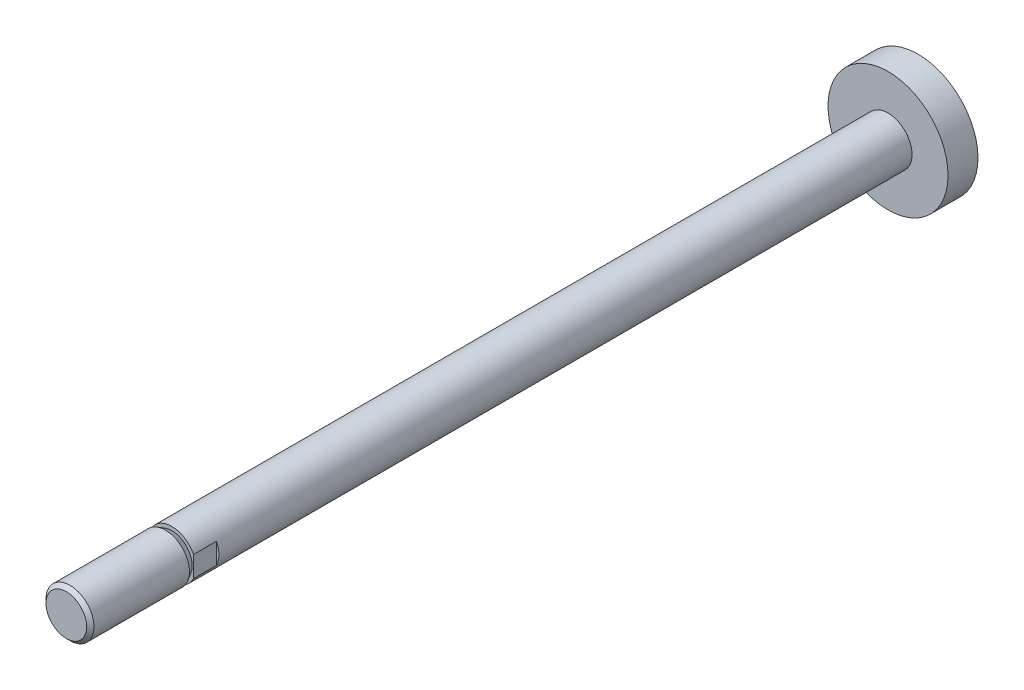
ISO-10303-21;
HEADER;
FILE_DESCRIPTION(('STEP AP214'),'2;1');
FILE_NAME('part.step','',(''),(''),'','','');
FILE_SCHEMA(('AUTOMOTIVE_DESIGN { 1 0 10303 214 1 1 1 1 }'));
ENDSEC;
DATA;
#1=APPLICATION_CONTEXT('core data for automotive mechanical design processes');
#2=APPLICATION_PROTOCOL_DEFINITION('international standard','automotive_design',2000,#1);
#3=PRODUCT_CONTEXT('',#1,'mechanical');
#4=PRODUCT('Part','Part','',(#3));
#5=PRODUCT_RELATED_PRODUCT_CATEGORY('part','',(#4));
#6=PRODUCT_DEFINITION_FORMATION('','',#4);
#7=PRODUCT_DEFINITION_CONTEXT('part definition',#1,'design');
#8=PRODUCT_DEFINITION('design','',#6,#7);
#9=PRODUCT_DEFINITION_SHAPE('','',#8);
#10=(LENGTH_UNIT() NAMED_UNIT(*) SI_UNIT(.MILLI.,.METRE.));
#11=(NAMED_UNIT(*) PLANE_ANGLE_UNIT() SI_UNIT($,.RADIAN.));
#12=(NAMED_UNIT(*) SI_UNIT($,.STERADIAN.) SOLID_ANGLE_UNIT());
#13=UNCERTAINTY_MEASURE_WITH_UNIT(LENGTH_MEASURE(1.E-05),#10,'distance_accuracy_value','');
#14=(GEOMETRIC_REPRESENTATION_CONTEXT(3) GLOBAL_UNCERTAINTY_ASSIGNED_CONTEXT((#13)) GLOBAL_UNIT_ASSIGNED_CONTEXT((#10,
#11,#12)) REPRESENTATION_CONTEXT('',''));
#15=CARTESIAN_POINT('',(0.,0.,0.));
#16=DIRECTION('',(0.,0.,1.));
#17=DIRECTION('',(1.,0.,0.));
#18=AXIS2_PLACEMENT_3D('',#15,#16,#17);
#19=CARTESIAN_POINT('',(0.,2.1165,50.));
#20=DIRECTION('',(0.,0.,1.));
#21=DIRECTION('',(1.,0.,0.));
#22=AXIS2_PLACEMENT_3D('',#19,#20,#21);
#23=PLANE('',#22);
#24=CARTESIAN_POINT('',(0.,0.,49.9999999999545));
#25=DIRECTION('',(0.,0.,-1.));
#26=DIRECTION('',(-1.,0.,0.));
#27=AXIS2_PLACEMENT_3D('',#24,#25,#26);
#28=CIRCLE('',#27,4.23300000005611);
#29=CARTESIAN_POINT('',(-4.23300000005611,0.,49.9999999999545));
#30=VERTEX_POINT('',#29);
#31=EDGE_CURVE('E20',#30,#30,#28,.T.);
#32=ORIENTED_EDGE('',*,*,#31,.F.);
#33=EDGE_LOOP('',(#32));
#34=FACE_BOUND('',#33,.T.);
#35=ADVANCED_FACE('F16',(#34),#23,.T.);
#36=CARTESIAN_POINT('',(0.,0.,49.2330000000152));
#37=DIRECTION('',(0.,0.,-1.));
#38=DIRECTION('',(-1.,0.,0.));
#39=AXIS2_PLACEMENT_3D('',#36,#37,#38);
#40=CONICAL_SURFACE('',#39,4.99999999999545,0.785398163397448);
#41=ORIENTED_EDGE('',*,*,#31,.T.);
#42=EDGE_LOOP('',(#41));
#43=FACE_BOUND('',#42,.T.);
#44=CARTESIAN_POINT('',(0.,0.,49.233));
#45=DIRECTION('',(0.,0.,1.));
#46=DIRECTION('',(1.,0.,0.));
#47=AXIS2_PLACEMENT_3D('',#44,#45,#46);
#48=CIRCLE('',#47,5.);
#49=CARTESIAN_POINT('',(5.,0.,49.233));
#50=VERTEX_POINT('',#49);
#51=EDGE_CURVE('E103',#50,#50,#48,.F.);
#52=ORIENTED_EDGE('',*,*,#51,.F.);
#53=EDGE_LOOP('',(#52));
#54=FACE_BOUND('',#53,.T.);
#55=ADVANCED_FACE('F215',(#43,#54),#40,.T.);
#56=CARTESIAN_POINT('',(0.,0.,39.2807414847027));
#57=DIRECTION('',(0.,0.,1.));
#58=DIRECTION('',(1.,0.,0.));
#59=AXIS2_PLACEMENT_3D('',#56,#57,#58);
#60=CYLINDRICAL_SURFACE('',#59,5.);
#61=ORIENTED_EDGE('',*,*,#51,.T.);
#62=EDGE_LOOP('',(#61));
#63=FACE_BOUND('',#62,.T.);
#64=CARTESIAN_POINT('',(0.,0.,29.328482969504));
#65=DIRECTION('',(0.,0.,1.));
#66=DIRECTION('',(0.,1.,0.));
#67=AXIS2_PLACEMENT_3D('',#64,#65,#66);
#68=CIRCLE('',#67,4.99999999999545);
#69=CARTESIAN_POINT('',(0.,4.99999999999545,29.328482969504));
#70=VERTEX_POINT('',#69);
#71=EDGE_CURVE('E63',#70,#70,#68,.F.);
#72=ORIENTED_EDGE('',*,*,#71,.F.);
#73=EDGE_LOOP('',(#72));
#74=FACE_BOUND('',#73,.T.);
#75=ADVANCED_FACE('F206',(#63,#74),#60,.T.);
#76=CARTESIAN_POINT('',(0.,6.25,-127.5));
#77=DIRECTION('',(0.,0.,-1.));
#78=DIRECTION('',(-1.,0.,0.));
#79=AXIS2_PLACEMENT_3D('',#76,#77,#78);
#80=PLANE('',#79);
#81=CARTESIAN_POINT('',(0.,0.,-127.5));
#82=DIRECTION('',(0.,0.,1.));
#83=DIRECTION('',(1.,0.,0.));
#84=AXIS2_PLACEMENT_3D('',#81,#82,#83);
#85=CIRCLE('',#84,12.5);
#86=CARTESIAN_POINT('',(12.5,0.,-127.5));
#87=VERTEX_POINT('',#86);
#88=EDGE_CURVE('E62',#87,#87,#85,.T.);
#89=ORIENTED_EDGE('',*,*,#88,.F.);
#90=EDGE_LOOP('',(#89));
#91=FACE_BOUND('',#90,.T.);
#92=ADVANCED_FACE('F197',(#91),#80,.T.);
#93=CARTESIAN_POINT('',(0.,0.,29.3284829693903));
#94=DIRECTION('',(0.,0.,1.));
#95=DIRECTION('',(1.,0.,0.));
#96=AXIS2_PLACEMENT_3D('',#93,#94,#95);
#97=CONICAL_SURFACE('',#96,4.99999999993861,0.523598775602609);
#98=ORIENTED_EDGE('',*,*,#71,.T.);
#99=EDGE_LOOP('',(#98));
#100=FACE_BOUND('',#99,.T.);
#101=CARTESIAN_POINT('',(0.,0.,27.9999999999632));
#102=DIRECTION('',(0.,0.,1.));
#103=DIRECTION('',(1.,0.,0.));
#104=AXIS2_PLACEMENT_3D('',#101,#102,#103);
#105=CIRCLE('',#104,4.2329999999184);
#106=CARTESIAN_POINT('',(4.2329999999184,0.,27.9999999999632));
#107=VERTEX_POINT('',#106);
#108=EDGE_CURVE('E79',#107,#107,#105,.F.);
#109=ORIENTED_EDGE('',*,*,#108,.F.);
#110=EDGE_LOOP('',(#109));
#111=FACE_BOUND('',#110,.T.);
#112=ADVANCED_FACE('F189',(#100,#111),#97,.T.);
#113=CARTESIAN_POINT('',(-4.5,22.,23.2));
#114=DIRECTION('',(0.,0.,-1.));
#115=DIRECTION('',(-1.,0.,0.));
#116=AXIS2_PLACEMENT_3D('',#113,#114,#115);
#117=PLANE('',#116);
#118=DIRECTION('',(0.,1.,0.));
#119=VECTOR('',#118,1.);
#120=CARTESIAN_POINT('',(-4.5,22.,23.2));
#121=LINE('',#120,#119);
#122=CARTESIAN_POINT('',(-4.5,-2.17944947177034,23.2));
#123=VERTEX_POINT('',#122);
#124=CARTESIAN_POINT('',(-4.5,2.17944947177034,23.2));
#125=VERTEX_POINT('',#124);
#126=EDGE_CURVE('E54',#123,#125,#121,.T.);
#127=ORIENTED_EDGE('',*,*,#126,.T.);
#128=CARTESIAN_POINT('',(0.,0.,23.2));
#129=DIRECTION('',(0.,0.,1.));
#130=DIRECTION('',(1.,0.,0.));
#131=AXIS2_PLACEMENT_3D('',#128,#129,#130);
#132=CIRCLE('',#131,5.);
#133=EDGE_CURVE('E58',#123,#125,#132,.F.);
#134=ORIENTED_EDGE('',*,*,#133,.F.);
#135=EDGE_LOOP('',(#127,#134));
#136=FACE_BOUND('',#135,.T.);
#137=ADVANCED_FACE('F56',(#136),#117,.F.);
#138=CARTESIAN_POINT('',(-4.5,22.,28.));
#139=DIRECTION('',(1.,0.,0.));
#140=DIRECTION('',(0.,0.,-1.));
#141=AXIS2_PLACEMENT_3D('',#138,#139,#140);
#142=PLANE('',#141);
#143=DIRECTION('',(0.,1.,0.));
#144=VECTOR('',#143,1.);
#145=CARTESIAN_POINT('',(-4.5,4.6165,28.));
#146=LINE('',#145,#144);
#147=CARTESIAN_POINT('',(-4.5,2.17944947177034,28.));
#148=VERTEX_POINT('',#147);
#149=CARTESIAN_POINT('',(-4.5,-2.17944947177034,28.));
#150=VERTEX_POINT('',#149);
#151=EDGE_CURVE('E70',#148,#150,#146,.F.);
#152=ORIENTED_EDGE('',*,*,#151,.F.);
#153=DIRECTION('',(0.,0.,1.));
#154=VECTOR('',#153,1.);
#155=CARTESIAN_POINT('',(-4.5,2.17944947177034,-46.625));
#156=LINE('',#155,#154);
#157=EDGE_CURVE('E67',#125,#148,#156,.T.);
#158=ORIENTED_EDGE('',*,*,#157,.F.);
#159=ORIENTED_EDGE('',*,*,#126,.F.);
#160=DIRECTION('',(0.,0.,1.));
#161=VECTOR('',#160,1.);
#162=CARTESIAN_POINT('',(-4.5,-2.17944947177034,-46.625));
#163=LINE('',#162,#161);
#164=EDGE_CURVE('E77',#150,#123,#163,.F.);
#165=ORIENTED_EDGE('',*,*,#164,.F.);
#166=EDGE_LOOP('',(#152,#158,#159,#165));
#167=FACE_BOUND('',#166,.T.);
#168=ADVANCED_FACE('F68',(#167),#142,.F.);
#169=CARTESIAN_POINT('',(0.,0.,-124.375));
#170=DIRECTION('',(0.,0.,1.));
#171=DIRECTION('',(1.,0.,0.));
#172=AXIS2_PLACEMENT_3D('',#169,#170,#171);
#173=CYLINDRICAL_SURFACE('',#172,12.5);
#174=CARTESIAN_POINT('',(0.,0.,-121.25));
#175=DIRECTION('',(0.,0.,1.));
#176=DIRECTION('',(1.,0.,0.));
#177=AXIS2_PLACEMENT_3D('',#174,#175,#176);
#178=CIRCLE('',#177,12.5);
#179=CARTESIAN_POINT('',(12.5,0.,-121.25));
#180=VERTEX_POINT('',#179);
#181=EDGE_CURVE('E73',#180,#180,#178,.T.);
#182=ORIENTED_EDGE('',*,*,#181,.F.);
#183=EDGE_LOOP('',(#182));
#184=FACE_BOUND('',#183,.T.);
#185=ORIENTED_EDGE('',*,*,#88,.T.);
#186=EDGE_LOOP('',(#185));
#187=FACE_BOUND('',#186,.T.);
#188=ADVANCED_FACE('F114',(#184,#187),#173,.T.);
#189=CARTESIAN_POINT('',(15.5,22.,23.2));
#190=DIRECTION('',(0.,0.,-1.));
#191=DIRECTION('',(-1.,0.,0.));
#192=AXIS2_PLACEMENT_3D('',#189,#190,#191);
#193=PLANE('',#192);
#194=DIRECTION('',(0.,1.,0.));
#195=VECTOR('',#194,1.);
#196=CARTESIAN_POINT('',(4.5,22.,23.2));
#197=LINE('',#196,#195);
#198=CARTESIAN_POINT('',(4.5,2.17944947177034,23.2));
#199=VERTEX_POINT('',#198);
#200=CARTESIAN_POINT('',(4.5,-2.17944947177034,23.2));
#201=VERTEX_POINT('',#200);
#202=EDGE_CURVE('E86',#199,#201,#197,.F.);
#203=ORIENTED_EDGE('',*,*,#202,.T.);
#204=CARTESIAN_POINT('',(0.,0.,23.2));
#205=DIRECTION('',(0.,0.,1.));
#206=DIRECTION('',(1.,0.,0.));
#207=AXIS2_PLACEMENT_3D('',#204,#205,#206);
#208=CIRCLE('',#207,5.);
#209=EDGE_CURVE('E98',#199,#201,#208,.F.);
#210=ORIENTED_EDGE('',*,*,#209,.F.);
#211=EDGE_LOOP('',(#203,#210));
#212=FACE_BOUND('',#211,.T.);
#213=ADVANCED_FACE('F116',(#212),#193,.F.);
#214=CARTESIAN_POINT('',(4.5,22.,23.2));
#215=DIRECTION('',(-1.,0.,0.));
#216=DIRECTION('',(0.,0.,1.));
#217=AXIS2_PLACEMENT_3D('',#214,#215,#216);
#218=PLANE('',#217);
#219=ORIENTED_EDGE('',*,*,#202,.F.);
#220=DIRECTION('',(0.,0.,1.));
#221=VECTOR('',#220,1.);
#222=CARTESIAN_POINT('',(4.5,2.17944947177034,-46.625));
#223=LINE('',#222,#221);
#224=CARTESIAN_POINT('',(4.5,2.17944947177034,28.));
#225=VERTEX_POINT('',#224);
#226=EDGE_CURVE('E96',#225,#199,#223,.F.);
#227=ORIENTED_EDGE('',*,*,#226,.F.);
#228=DIRECTION('',(0.,1.,0.));
#229=VECTOR('',#228,1.);
#230=CARTESIAN_POINT('',(4.5,4.6165,28.));
#231=LINE('',#230,#229);
#232=CARTESIAN_POINT('',(4.5,-2.17944947177034,28.));
#233=VERTEX_POINT('',#232);
#234=EDGE_CURVE('E35',#233,#225,#231,.T.);
#235=ORIENTED_EDGE('',*,*,#234,.F.);
#236=DIRECTION('',(0.,0.,1.));
#237=VECTOR('',#236,1.);
#238=CARTESIAN_POINT('',(4.5,-2.17944947177034,-46.625));
#239=LINE('',#238,#237);
#240=EDGE_CURVE('E95',#201,#233,#239,.T.);
#241=ORIENTED_EDGE('',*,*,#240,.F.);
#242=EDGE_LOOP('',(#219,#227,#235,#241));
#243=FACE_BOUND('',#242,.T.);
#244=ADVANCED_FACE('F123',(#243),#218,.F.);
#245=CARTESIAN_POINT('',(0.,4.6165,28.));
#246=DIRECTION('',(0.,0.,1.));
#247=DIRECTION('',(1.,0.,0.));
#248=AXIS2_PLACEMENT_3D('',#245,#246,#247);
#249=PLANE('',#248);
#250=ORIENTED_EDGE('',*,*,#108,.T.);
#251=EDGE_LOOP('',(#250));
#252=FACE_BOUND('',#251,.T.);
#253=CARTESIAN_POINT('',(0.,0.,28.));
#254=DIRECTION('',(0.,0.,1.));
#255=DIRECTION('',(1.,0.,0.));
#256=AXIS2_PLACEMENT_3D('',#253,#254,#255);
#257=CIRCLE('',#256,5.);
#258=EDGE_CURVE('E99',#148,#225,#257,.F.);
#259=ORIENTED_EDGE('',*,*,#258,.F.);
#260=ORIENTED_EDGE('',*,*,#151,.T.);
#261=CARTESIAN_POINT('',(0.,0.,28.));
#262=DIRECTION('',(0.,0.,1.));
#263=DIRECTION('',(1.,0.,0.));
#264=AXIS2_PLACEMENT_3D('',#261,#262,#263);
#265=CIRCLE('',#264,5.);
#266=EDGE_CURVE('E26',#233,#150,#265,.F.);
#267=ORIENTED_EDGE('',*,*,#266,.F.);
#268=ORIENTED_EDGE('',*,*,#234,.T.);
#269=EDGE_LOOP('',(#259,#260,#267,#268));
#270=FACE_BOUND('',#269,.T.);
#271=ADVANCED_FACE('F130',(#252,#270),#249,.T.);
#272=CARTESIAN_POINT('',(0.,8.75,-121.25));
#273=DIRECTION('',(0.,0.,1.));
#274=DIRECTION('',(1.,0.,0.));
#275=AXIS2_PLACEMENT_3D('',#272,#273,#274);
#276=PLANE('',#275);
#277=ORIENTED_EDGE('',*,*,#181,.T.);
#278=EDGE_LOOP('',(#277));
#279=FACE_BOUND('',#278,.T.);
#280=CARTESIAN_POINT('',(0.,0.,-121.25));
#281=DIRECTION('',(0.,0.,1.));
#282=DIRECTION('',(1.,0.,0.));
#283=AXIS2_PLACEMENT_3D('',#280,#281,#282);
#284=CIRCLE('',#283,5.);
#285=CARTESIAN_POINT('',(5.,0.,-121.25));
#286=VERTEX_POINT('',#285);
#287=EDGE_CURVE('E11',#286,#286,#284,.T.);
#288=ORIENTED_EDGE('',*,*,#287,.F.);
#289=EDGE_LOOP('',(#288));
#290=FACE_BOUND('',#289,.T.);
#291=ADVANCED_FACE('F111',(#279,#290),#276,.T.);
#292=CARTESIAN_POINT('',(0.,0.,-46.625));
#293=DIRECTION('',(0.,0.,1.));
#294=DIRECTION('',(1.,0.,0.));
#295=AXIS2_PLACEMENT_3D('',#292,#293,#294);
#296=CYLINDRICAL_SURFACE('',#295,5.);
#297=ORIENTED_EDGE('',*,*,#157,.T.);
#298=ORIENTED_EDGE('',*,*,#258,.T.);
#299=ORIENTED_EDGE('',*,*,#226,.T.);
#300=ORIENTED_EDGE('',*,*,#209,.T.);
#301=ORIENTED_EDGE('',*,*,#240,.T.);
#302=ORIENTED_EDGE('',*,*,#266,.T.);
#303=ORIENTED_EDGE('',*,*,#164,.T.);
#304=ORIENTED_EDGE('',*,*,#133,.T.);
#305=EDGE_LOOP('',(#297,#298,#299,#300,#301,#302,#303,#304));
#306=FACE_BOUND('',#305,.T.);
#307=ORIENTED_EDGE('',*,*,#287,.T.);
#308=EDGE_LOOP('',(#307));
#309=FACE_BOUND('',#308,.T.);
#310=ADVANCED_FACE('F18',(#306,#309),#296,.T.);
#311=CLOSED_SHELL('',(#35,#55,#75,#92,#112,#137,#168,#188,#213,#244,#271,#291,#310));
#312=MANIFOLD_SOLID_BREP('B1',#311);
#313=ADVANCED_BREP_SHAPE_REPRESENTATION('',(#18,#312),#14);
#314=SHAPE_DEFINITION_REPRESENTATION(#9,#313);
ENDSEC;
END-ISO-10303-21;
